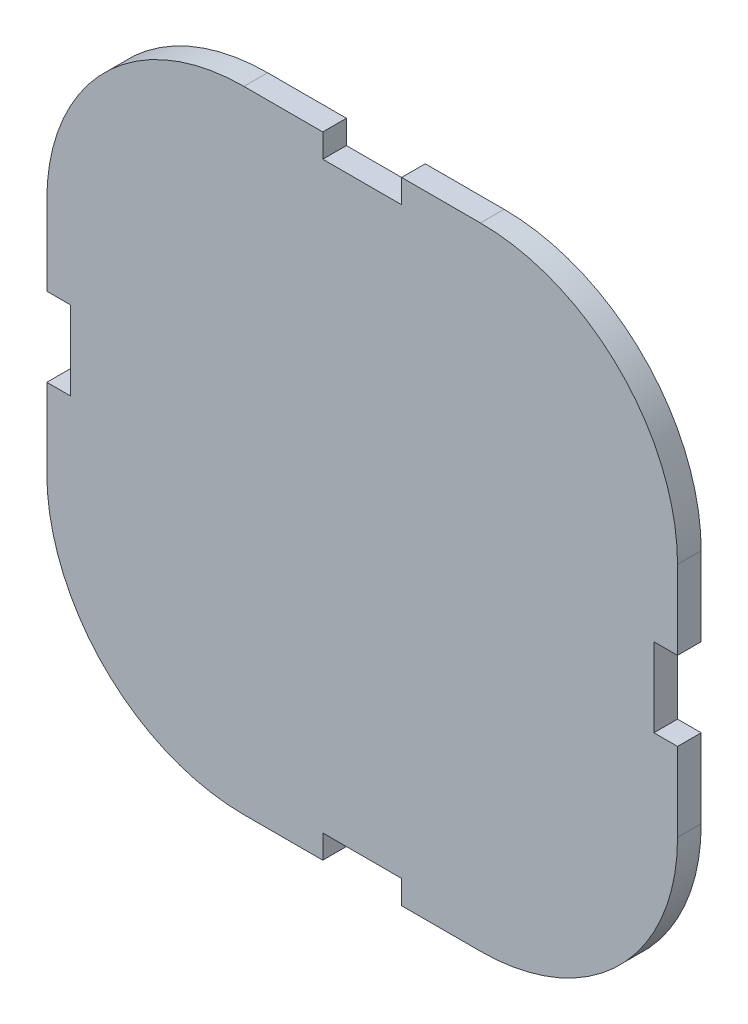
ISO-10303-21;
HEADER;
FILE_DESCRIPTION(('STEP AP214'),'2;1');
FILE_NAME('part.step','',(''),(''),'','','');
FILE_SCHEMA(('AUTOMOTIVE_DESIGN { 1 0 10303 214 1 1 1 1 }'));
ENDSEC;
DATA;
#1=APPLICATION_CONTEXT('core data for automotive mechanical design processes');
#2=APPLICATION_PROTOCOL_DEFINITION('international standard','automotive_design',2000,#1);
#3=PRODUCT_CONTEXT('',#1,'mechanical');
#4=PRODUCT('Part','Part','',(#3));
#5=PRODUCT_RELATED_PRODUCT_CATEGORY('part','',(#4));
#6=PRODUCT_DEFINITION_FORMATION('','',#4);
#7=PRODUCT_DEFINITION_CONTEXT('part definition',#1,'design');
#8=PRODUCT_DEFINITION('design','',#6,#7);
#9=PRODUCT_DEFINITION_SHAPE('','',#8);
#10=(LENGTH_UNIT() NAMED_UNIT(*) SI_UNIT(.MILLI.,.METRE.));
#11=(NAMED_UNIT(*) PLANE_ANGLE_UNIT() SI_UNIT($,.RADIAN.));
#12=(NAMED_UNIT(*) SI_UNIT($,.STERADIAN.) SOLID_ANGLE_UNIT());
#13=UNCERTAINTY_MEASURE_WITH_UNIT(LENGTH_MEASURE(1.E-05),#10,'distance_accuracy_value','');
#14=(GEOMETRIC_REPRESENTATION_CONTEXT(3) GLOBAL_UNCERTAINTY_ASSIGNED_CONTEXT((#13)) GLOBAL_UNIT_ASSIGNED_CONTEXT((#10,
#11,#12)) REPRESENTATION_CONTEXT('',''));
#15=CARTESIAN_POINT('',(0.,0.,0.));
#16=DIRECTION('',(0.,0.,1.));
#17=DIRECTION('',(1.,0.,0.));
#18=AXIS2_PLACEMENT_3D('',#15,#16,#17);
#19=CARTESIAN_POINT('',(0.,40.,3.));
#20=DIRECTION('',(0.,1.,0.));
#21=DIRECTION('',(-1.,0.,0.));
#22=AXIS2_PLACEMENT_3D('',#19,#20,#21);
#23=PLANE('',#22);
#24=DIRECTION('',(1.,0.,0.));
#25=VECTOR('',#24,1.);
#26=CARTESIAN_POINT('',(0.,40.,0.));
#27=LINE('',#26,#25);
#28=CARTESIAN_POINT('',(-15.,40.,0.));
#29=VERTEX_POINT('',#28);
#30=CARTESIAN_POINT('',(-5.,40.,0.));
#31=VERTEX_POINT('',#30);
#32=EDGE_CURVE('E225',#29,#31,#27,.T.);
#33=ORIENTED_EDGE('',*,*,#32,.F.);
#34=DIRECTION('',(0.,0.,-1.));
#35=VECTOR('',#34,1.);
#36=CARTESIAN_POINT('',(-15.,40.,3.));
#37=LINE('',#36,#35);
#38=CARTESIAN_POINT('',(-15.,40.,3.));
#39=VERTEX_POINT('',#38);
#40=EDGE_CURVE('E11',#39,#29,#37,.T.);
#41=ORIENTED_EDGE('',*,*,#40,.F.);
#42=DIRECTION('',(1.,0.,0.));
#43=VECTOR('',#42,1.);
#44=CARTESIAN_POINT('',(0.,40.,3.));
#45=LINE('',#44,#43);
#46=CARTESIAN_POINT('',(-5.,40.,3.));
#47=VERTEX_POINT('',#46);
#48=EDGE_CURVE('E279',#39,#47,#45,.T.);
#49=ORIENTED_EDGE('',*,*,#48,.T.);
#50=DIRECTION('',(0.,0.,-1.));
#51=VECTOR('',#50,1.);
#52=CARTESIAN_POINT('',(-5.,40.,3.));
#53=LINE('',#52,#51);
#54=EDGE_CURVE('E51',#47,#31,#53,.T.);
#55=ORIENTED_EDGE('',*,*,#54,.T.);
#56=EDGE_LOOP('',(#33,#41,#49,#55));
#57=FACE_BOUND('',#56,.T.);
#58=ADVANCED_FACE('F34',(#57),#23,.T.);
#59=CARTESIAN_POINT('',(-15.,15.,3.));
#60=DIRECTION('',(0.,0.,-1.));
#61=DIRECTION('',(-1.,0.,0.));
#62=AXIS2_PLACEMENT_3D('',#59,#60,#61);
#63=CYLINDRICAL_SURFACE('',#62,25.);
#64=CARTESIAN_POINT('',(-15.,15.,0.));
#65=DIRECTION('',(0.,0.,1.));
#66=DIRECTION('',(1.,0.,0.));
#67=AXIS2_PLACEMENT_3D('',#64,#65,#66);
#68=CIRCLE('',#67,25.);
#69=CARTESIAN_POINT('',(-40.,15.,0.));
#70=VERTEX_POINT('',#69);
#71=EDGE_CURVE('E227',#29,#70,#68,.T.);
#72=ORIENTED_EDGE('',*,*,#71,.T.);
#73=DIRECTION('',(0.,0.,-1.));
#74=VECTOR('',#73,1.);
#75=CARTESIAN_POINT('',(-40.,15.,3.));
#76=LINE('',#75,#74);
#77=CARTESIAN_POINT('',(-40.,15.,3.));
#78=VERTEX_POINT('',#77);
#79=EDGE_CURVE('E43',#78,#70,#76,.T.);
#80=ORIENTED_EDGE('',*,*,#79,.F.);
#81=CARTESIAN_POINT('',(-15.,15.,3.));
#82=DIRECTION('',(0.,0.,1.));
#83=DIRECTION('',(1.,0.,0.));
#84=AXIS2_PLACEMENT_3D('',#81,#82,#83);
#85=CIRCLE('',#84,25.);
#86=EDGE_CURVE('E350',#39,#78,#85,.T.);
#87=ORIENTED_EDGE('',*,*,#86,.F.);
#88=ORIENTED_EDGE('',*,*,#40,.T.);
#89=EDGE_LOOP('',(#72,#80,#87,#88));
#90=FACE_BOUND('',#89,.T.);
#91=ADVANCED_FACE('F36',(#90),#63,.T.);
#92=CARTESIAN_POINT('',(-40.,0.,3.));
#93=DIRECTION('',(1.,0.,0.));
#94=DIRECTION('',(0.,1.,0.));
#95=AXIS2_PLACEMENT_3D('',#92,#93,#94);
#96=PLANE('',#95);
#97=DIRECTION('',(0.,-1.,0.));
#98=VECTOR('',#97,1.);
#99=CARTESIAN_POINT('',(-40.,0.,0.));
#100=LINE('',#99,#98);
#101=CARTESIAN_POINT('',(-40.,4.99999999999999,0.));
#102=VERTEX_POINT('',#101);
#103=EDGE_CURVE('E230',#70,#102,#100,.T.);
#104=ORIENTED_EDGE('',*,*,#103,.T.);
#105=DIRECTION('',(0.,0.,-1.));
#106=VECTOR('',#105,1.);
#107=CARTESIAN_POINT('',(-40.,4.99999999999999,3.));
#108=LINE('',#107,#106);
#109=CARTESIAN_POINT('',(-40.,4.99999999999999,3.));
#110=VERTEX_POINT('',#109);
#111=EDGE_CURVE('E323',#110,#102,#108,.T.);
#112=ORIENTED_EDGE('',*,*,#111,.F.);
#113=DIRECTION('',(0.,-1.,0.));
#114=VECTOR('',#113,1.);
#115=CARTESIAN_POINT('',(-40.,0.,3.));
#116=LINE('',#115,#114);
#117=EDGE_CURVE('E332',#78,#110,#116,.T.);
#118=ORIENTED_EDGE('',*,*,#117,.F.);
#119=ORIENTED_EDGE('',*,*,#79,.T.);
#120=EDGE_LOOP('',(#104,#112,#118,#119));
#121=FACE_BOUND('',#120,.T.);
#122=ADVANCED_FACE('F330',(#121),#96,.F.);
#123=CARTESIAN_POINT('',(0.,4.99999999999999,3.));
#124=DIRECTION('',(0.,1.,0.));
#125=DIRECTION('',(0.,0.,1.));
#126=AXIS2_PLACEMENT_3D('',#123,#124,#125);
#127=PLANE('',#126);
#128=DIRECTION('',(1.,0.,0.));
#129=VECTOR('',#128,1.);
#130=CARTESIAN_POINT('',(0.,4.99999999999999,0.));
#131=LINE('',#130,#129);
#132=CARTESIAN_POINT('',(-37.,4.99999999999999,0.));
#133=VERTEX_POINT('',#132);
#134=EDGE_CURVE('E232',#102,#133,#131,.T.);
#135=ORIENTED_EDGE('',*,*,#134,.T.);
#136=DIRECTION('',(0.,0.,-1.));
#137=VECTOR('',#136,1.);
#138=CARTESIAN_POINT('',(-37.,4.99999999999999,3.));
#139=LINE('',#138,#137);
#140=CARTESIAN_POINT('',(-37.,4.99999999999999,3.));
#141=VERTEX_POINT('',#140);
#142=EDGE_CURVE('E321',#141,#133,#139,.T.);
#143=ORIENTED_EDGE('',*,*,#142,.F.);
#144=DIRECTION('',(1.,0.,0.));
#145=VECTOR('',#144,1.);
#146=CARTESIAN_POINT('',(0.,4.99999999999999,3.));
#147=LINE('',#146,#145);
#148=EDGE_CURVE('E344',#110,#141,#147,.T.);
#149=ORIENTED_EDGE('',*,*,#148,.F.);
#150=ORIENTED_EDGE('',*,*,#111,.T.);
#151=EDGE_LOOP('',(#135,#143,#149,#150));
#152=FACE_BOUND('',#151,.T.);
#153=ADVANCED_FACE('F341',(#152),#127,.F.);
#154=CARTESIAN_POINT('',(-37.,0.,3.));
#155=DIRECTION('',(-1.,0.,0.));
#156=DIRECTION('',(0.,0.,1.));
#157=AXIS2_PLACEMENT_3D('',#154,#155,#156);
#158=PLANE('',#157);
#159=DIRECTION('',(0.,1.,0.));
#160=VECTOR('',#159,1.);
#161=CARTESIAN_POINT('',(-37.,0.,0.));
#162=LINE('',#161,#160);
#163=CARTESIAN_POINT('',(-37.,-5.00000000000001,0.));
#164=VERTEX_POINT('',#163);
#165=EDGE_CURVE('E236',#164,#133,#162,.T.);
#166=ORIENTED_EDGE('',*,*,#165,.F.);
#167=DIRECTION('',(0.,0.,-1.));
#168=VECTOR('',#167,1.);
#169=CARTESIAN_POINT('',(-37.,-5.00000000000001,3.));
#170=LINE('',#169,#168);
#171=CARTESIAN_POINT('',(-37.,-5.00000000000001,3.));
#172=VERTEX_POINT('',#171);
#173=EDGE_CURVE('E319',#172,#164,#170,.T.);
#174=ORIENTED_EDGE('',*,*,#173,.F.);
#175=DIRECTION('',(0.,1.,0.));
#176=VECTOR('',#175,1.);
#177=CARTESIAN_POINT('',(-37.,0.,3.));
#178=LINE('',#177,#176);
#179=EDGE_CURVE('E346',#172,#141,#178,.T.);
#180=ORIENTED_EDGE('',*,*,#179,.T.);
#181=ORIENTED_EDGE('',*,*,#142,.T.);
#182=EDGE_LOOP('',(#166,#174,#180,#181));
#183=FACE_BOUND('',#182,.T.);
#184=ADVANCED_FACE('F474',(#183),#158,.T.);
#185=CARTESIAN_POINT('',(0.,-4.99999999999999,3.));
#186=DIRECTION('',(0.,1.,0.));
#187=DIRECTION('',(-1.,0.,0.));
#188=AXIS2_PLACEMENT_3D('',#185,#186,#187);
#189=PLANE('',#188);
#190=DIRECTION('',(1.,0.,0.));
#191=VECTOR('',#190,1.);
#192=CARTESIAN_POINT('',(0.,-4.99999999999999,0.));
#193=LINE('',#192,#191);
#194=CARTESIAN_POINT('',(-40.,-5.00000000000001,0.));
#195=VERTEX_POINT('',#194);
#196=EDGE_CURVE('E239',#195,#164,#193,.T.);
#197=ORIENTED_EDGE('',*,*,#196,.F.);
#198=DIRECTION('',(0.,0.,-1.));
#199=VECTOR('',#198,1.);
#200=CARTESIAN_POINT('',(-40.,-5.00000000000001,3.));
#201=LINE('',#200,#199);
#202=CARTESIAN_POINT('',(-40.,-5.00000000000001,3.));
#203=VERTEX_POINT('',#202);
#204=EDGE_CURVE('E317',#203,#195,#201,.T.);
#205=ORIENTED_EDGE('',*,*,#204,.F.);
#206=DIRECTION('',(1.,0.,0.));
#207=VECTOR('',#206,1.);
#208=CARTESIAN_POINT('',(0.,-4.99999999999999,3.));
#209=LINE('',#208,#207);
#210=EDGE_CURVE('E348',#203,#172,#209,.T.);
#211=ORIENTED_EDGE('',*,*,#210,.T.);
#212=ORIENTED_EDGE('',*,*,#173,.T.);
#213=EDGE_LOOP('',(#197,#205,#211,#212));
#214=FACE_BOUND('',#213,.T.);
#215=ADVANCED_FACE('F470',(#214),#189,.T.);
#216=CARTESIAN_POINT('',(-40.,-15.,0.));
#217=VERTEX_POINT('',#216);
#218=EDGE_CURVE('E233',#195,#217,#100,.T.);
#219=ORIENTED_EDGE('',*,*,#218,.T.);
#220=DIRECTION('',(0.,0.,-1.));
#221=VECTOR('',#220,1.);
#222=CARTESIAN_POINT('',(-40.,-15.,3.));
#223=LINE('',#222,#221);
#224=CARTESIAN_POINT('',(-40.,-15.,3.));
#225=VERTEX_POINT('',#224);
#226=EDGE_CURVE('E314',#225,#217,#223,.T.);
#227=ORIENTED_EDGE('',*,*,#226,.F.);
#228=EDGE_CURVE('E352',#203,#225,#116,.T.);
#229=ORIENTED_EDGE('',*,*,#228,.F.);
#230=ORIENTED_EDGE('',*,*,#204,.T.);
#231=EDGE_LOOP('',(#219,#227,#229,#230));
#232=FACE_BOUND('',#231,.T.);
#233=ADVANCED_FACE('F466',(#232),#96,.F.);
#234=CARTESIAN_POINT('',(-15.,-15.,3.));
#235=DIRECTION('',(0.,0.,-1.));
#236=DIRECTION('',(-1.,0.,0.));
#237=AXIS2_PLACEMENT_3D('',#234,#235,#236);
#238=CYLINDRICAL_SURFACE('',#237,25.);
#239=CARTESIAN_POINT('',(-15.,-15.,0.));
#240=DIRECTION('',(0.,0.,1.));
#241=DIRECTION('',(1.,0.,0.));
#242=AXIS2_PLACEMENT_3D('',#239,#240,#241);
#243=CIRCLE('',#242,25.);
#244=CARTESIAN_POINT('',(-15.,-40.,0.));
#245=VERTEX_POINT('',#244);
#246=EDGE_CURVE('E242',#217,#245,#243,.T.);
#247=ORIENTED_EDGE('',*,*,#246,.T.);
#248=DIRECTION('',(0.,0.,-1.));
#249=VECTOR('',#248,1.);
#250=CARTESIAN_POINT('',(-15.,-40.,3.));
#251=LINE('',#250,#249);
#252=CARTESIAN_POINT('',(-15.,-40.,3.));
#253=VERTEX_POINT('',#252);
#254=EDGE_CURVE('E311',#253,#245,#251,.T.);
#255=ORIENTED_EDGE('',*,*,#254,.F.);
#256=CARTESIAN_POINT('',(-15.,-15.,3.));
#257=DIRECTION('',(0.,0.,1.));
#258=DIRECTION('',(1.,0.,0.));
#259=AXIS2_PLACEMENT_3D('',#256,#257,#258);
#260=CIRCLE('',#259,25.);
#261=EDGE_CURVE('E357',#225,#253,#260,.T.);
#262=ORIENTED_EDGE('',*,*,#261,.F.);
#263=ORIENTED_EDGE('',*,*,#226,.T.);
#264=EDGE_LOOP('',(#247,#255,#262,#263));
#265=FACE_BOUND('',#264,.T.);
#266=ADVANCED_FACE('F463',(#265),#238,.T.);
#267=CARTESIAN_POINT('',(0.,-40.,3.));
#268=DIRECTION('',(0.,1.,0.));
#269=DIRECTION('',(-1.,0.,0.));
#270=AXIS2_PLACEMENT_3D('',#267,#268,#269);
#271=PLANE('',#270);
#272=DIRECTION('',(1.,0.,0.));
#273=VECTOR('',#272,1.);
#274=CARTESIAN_POINT('',(0.,-40.,0.));
#275=LINE('',#274,#273);
#276=CARTESIAN_POINT('',(-4.99999999999998,-40.,0.));
#277=VERTEX_POINT('',#276);
#278=EDGE_CURVE('E244',#245,#277,#275,.T.);
#279=ORIENTED_EDGE('',*,*,#278,.T.);
#280=DIRECTION('',(0.,0.,-1.));
#281=VECTOR('',#280,1.);
#282=CARTESIAN_POINT('',(-4.99999999999998,-40.,3.));
#283=LINE('',#282,#281);
#284=CARTESIAN_POINT('',(-4.99999999999998,-40.,3.));
#285=VERTEX_POINT('',#284);
#286=EDGE_CURVE('E308',#285,#277,#283,.T.);
#287=ORIENTED_EDGE('',*,*,#286,.F.);
#288=DIRECTION('',(1.,0.,0.));
#289=VECTOR('',#288,1.);
#290=CARTESIAN_POINT('',(0.,-40.,3.));
#291=LINE('',#290,#289);
#292=EDGE_CURVE('E359',#253,#285,#291,.T.);
#293=ORIENTED_EDGE('',*,*,#292,.F.);
#294=ORIENTED_EDGE('',*,*,#254,.T.);
#295=EDGE_LOOP('',(#279,#287,#293,#294));
#296=FACE_BOUND('',#295,.T.);
#297=ADVANCED_FACE('F451',(#296),#271,.F.);
#298=CARTESIAN_POINT('',(-5.00000000000016,0.,3.));
#299=DIRECTION('',(-1.,0.,0.));
#300=DIRECTION('',(0.,-1.,0.));
#301=AXIS2_PLACEMENT_3D('',#298,#299,#300);
#302=PLANE('',#301);
#303=DIRECTION('',(0.,1.,0.));
#304=VECTOR('',#303,1.);
#305=CARTESIAN_POINT('',(-5.00000000000016,0.,0.));
#306=LINE('',#305,#304);
#307=CARTESIAN_POINT('',(-4.99999999999999,-37.,0.));
#308=VERTEX_POINT('',#307);
#309=EDGE_CURVE('E246',#277,#308,#306,.T.);
#310=ORIENTED_EDGE('',*,*,#309,.T.);
#311=DIRECTION('',(0.,0.,-1.));
#312=VECTOR('',#311,1.);
#313=CARTESIAN_POINT('',(-4.99999999999999,-37.,3.));
#314=LINE('',#313,#312);
#315=CARTESIAN_POINT('',(-4.99999999999999,-37.,3.));
#316=VERTEX_POINT('',#315);
#317=EDGE_CURVE('E305',#316,#308,#314,.T.);
#318=ORIENTED_EDGE('',*,*,#317,.F.);
#319=DIRECTION('',(0.,1.,0.));
#320=VECTOR('',#319,1.);
#321=CARTESIAN_POINT('',(-5.00000000000016,0.,3.));
#322=LINE('',#321,#320);
#323=EDGE_CURVE('E361',#285,#316,#322,.T.);
#324=ORIENTED_EDGE('',*,*,#323,.F.);
#325=ORIENTED_EDGE('',*,*,#286,.T.);
#326=EDGE_LOOP('',(#310,#318,#324,#325));
#327=FACE_BOUND('',#326,.T.);
#328=ADVANCED_FACE('F458',(#327),#302,.F.);
#329=CARTESIAN_POINT('',(0.,-37.,3.));
#330=DIRECTION('',(0.,1.,0.));
#331=DIRECTION('',(-1.,0.,0.));
#332=AXIS2_PLACEMENT_3D('',#329,#330,#331);
#333=PLANE('',#332);
#334=DIRECTION('',(1.,0.,0.));
#335=VECTOR('',#334,1.);
#336=CARTESIAN_POINT('',(0.,-37.,0.));
#337=LINE('',#336,#335);
#338=CARTESIAN_POINT('',(5.00000000000001,-37.,0.));
#339=VERTEX_POINT('',#338);
#340=EDGE_CURVE('E249',#308,#339,#337,.T.);
#341=ORIENTED_EDGE('',*,*,#340,.T.);
#342=DIRECTION('',(0.,0.,-1.));
#343=VECTOR('',#342,1.);
#344=CARTESIAN_POINT('',(5.00000000000001,-37.,3.));
#345=LINE('',#344,#343);
#346=CARTESIAN_POINT('',(5.00000000000001,-37.,3.));
#347=VERTEX_POINT('',#346);
#348=EDGE_CURVE('E303',#347,#339,#345,.T.);
#349=ORIENTED_EDGE('',*,*,#348,.F.);
#350=DIRECTION('',(1.,0.,0.));
#351=VECTOR('',#350,1.);
#352=CARTESIAN_POINT('',(0.,-37.,3.));
#353=LINE('',#352,#351);
#354=EDGE_CURVE('E364',#316,#347,#353,.T.);
#355=ORIENTED_EDGE('',*,*,#354,.F.);
#356=ORIENTED_EDGE('',*,*,#317,.T.);
#357=EDGE_LOOP('',(#341,#349,#355,#356));
#358=FACE_BOUND('',#357,.T.);
#359=ADVANCED_FACE('F454',(#358),#333,.F.);
#360=CARTESIAN_POINT('',(4.99999999999984,0.,3.));
#361=DIRECTION('',(-1.,0.,0.));
#362=DIRECTION('',(0.,-1.,0.));
#363=AXIS2_PLACEMENT_3D('',#360,#361,#362);
#364=PLANE('',#363);
#365=DIRECTION('',(0.,1.,0.));
#366=VECTOR('',#365,1.);
#367=CARTESIAN_POINT('',(4.99999999999984,0.,0.));
#368=LINE('',#367,#366);
#369=CARTESIAN_POINT('',(5.00000000000001,-40.,0.));
#370=VERTEX_POINT('',#369);
#371=EDGE_CURVE('E252',#370,#339,#368,.T.);
#372=ORIENTED_EDGE('',*,*,#371,.F.);
#373=DIRECTION('',(0.,0.,-1.));
#374=VECTOR('',#373,1.);
#375=CARTESIAN_POINT('',(5.00000000000001,-40.,3.));
#376=LINE('',#375,#374);
#377=CARTESIAN_POINT('',(5.00000000000001,-40.,3.));
#378=VERTEX_POINT('',#377);
#379=EDGE_CURVE('E301',#378,#370,#376,.T.);
#380=ORIENTED_EDGE('',*,*,#379,.F.);
#381=DIRECTION('',(0.,1.,0.));
#382=VECTOR('',#381,1.);
#383=CARTESIAN_POINT('',(4.99999999999984,0.,3.));
#384=LINE('',#383,#382);
#385=EDGE_CURVE('E366',#378,#347,#384,.T.);
#386=ORIENTED_EDGE('',*,*,#385,.T.);
#387=ORIENTED_EDGE('',*,*,#348,.T.);
#388=EDGE_LOOP('',(#372,#380,#386,#387));
#389=FACE_BOUND('',#388,.T.);
#390=ADVANCED_FACE('F449',(#389),#364,.T.);
#391=CARTESIAN_POINT('',(15.,-40.,0.));
#392=VERTEX_POINT('',#391);
#393=EDGE_CURVE('E247',#370,#392,#275,.T.);
#394=ORIENTED_EDGE('',*,*,#393,.T.);
#395=DIRECTION('',(0.,0.,-1.));
#396=VECTOR('',#395,1.);
#397=CARTESIAN_POINT('',(15.,-40.,3.));
#398=LINE('',#397,#396);
#399=CARTESIAN_POINT('',(15.,-40.,3.));
#400=VERTEX_POINT('',#399);
#401=EDGE_CURVE('E298',#400,#392,#398,.T.);
#402=ORIENTED_EDGE('',*,*,#401,.F.);
#403=EDGE_CURVE('E362',#378,#400,#291,.T.);
#404=ORIENTED_EDGE('',*,*,#403,.F.);
#405=ORIENTED_EDGE('',*,*,#379,.T.);
#406=EDGE_LOOP('',(#394,#402,#404,#405));
#407=FACE_BOUND('',#406,.T.);
#408=ADVANCED_FACE('F445',(#407),#271,.F.);
#409=CARTESIAN_POINT('',(15.,-15.,3.));
#410=DIRECTION('',(0.,0.,-1.));
#411=DIRECTION('',(-1.,0.,0.));
#412=AXIS2_PLACEMENT_3D('',#409,#410,#411);
#413=CYLINDRICAL_SURFACE('',#412,25.);
#414=CARTESIAN_POINT('',(15.,-15.,0.));
#415=DIRECTION('',(0.,0.,1.));
#416=DIRECTION('',(1.,0.,0.));
#417=AXIS2_PLACEMENT_3D('',#414,#415,#416);
#418=CIRCLE('',#417,25.);
#419=CARTESIAN_POINT('',(40.,-15.,0.));
#420=VERTEX_POINT('',#419);
#421=EDGE_CURVE('E255',#392,#420,#418,.T.);
#422=ORIENTED_EDGE('',*,*,#421,.T.);
#423=DIRECTION('',(0.,0.,-1.));
#424=VECTOR('',#423,1.);
#425=CARTESIAN_POINT('',(40.,-15.,3.));
#426=LINE('',#425,#424);
#427=CARTESIAN_POINT('',(40.,-15.,3.));
#428=VERTEX_POINT('',#427);
#429=EDGE_CURVE('E296',#428,#420,#426,.T.);
#430=ORIENTED_EDGE('',*,*,#429,.F.);
#431=CARTESIAN_POINT('',(15.,-15.,3.));
#432=DIRECTION('',(0.,0.,1.));
#433=DIRECTION('',(1.,0.,0.));
#434=AXIS2_PLACEMENT_3D('',#431,#432,#433);
#435=CIRCLE('',#434,25.);
#436=EDGE_CURVE('E369',#400,#428,#435,.T.);
#437=ORIENTED_EDGE('',*,*,#436,.F.);
#438=ORIENTED_EDGE('',*,*,#401,.T.);
#439=EDGE_LOOP('',(#422,#430,#437,#438));
#440=FACE_BOUND('',#439,.T.);
#441=ADVANCED_FACE('F442',(#440),#413,.T.);
#442=CARTESIAN_POINT('',(40.,0.,3.));
#443=DIRECTION('',(1.,0.,0.));
#444=DIRECTION('',(0.,0.,-1.));
#445=AXIS2_PLACEMENT_3D('',#442,#443,#444);
#446=PLANE('',#445);
#447=DIRECTION('',(0.,-1.,0.));
#448=VECTOR('',#447,1.);
#449=CARTESIAN_POINT('',(40.,0.,0.));
#450=LINE('',#449,#448);
#451=CARTESIAN_POINT('',(40.,-5.00000000000001,0.));
#452=VERTEX_POINT('',#451);
#453=EDGE_CURVE('E258',#452,#420,#450,.T.);
#454=ORIENTED_EDGE('',*,*,#453,.F.);
#455=DIRECTION('',(0.,0.,-1.));
#456=VECTOR('',#455,1.);
#457=CARTESIAN_POINT('',(40.,-5.00000000000001,3.));
#458=LINE('',#457,#456);
#459=CARTESIAN_POINT('',(40.,-5.00000000000001,3.));
#460=VERTEX_POINT('',#459);
#461=EDGE_CURVE('E294',#460,#452,#458,.T.);
#462=ORIENTED_EDGE('',*,*,#461,.F.);
#463=DIRECTION('',(0.,-1.,0.));
#464=VECTOR('',#463,1.);
#465=CARTESIAN_POINT('',(40.,0.,3.));
#466=LINE('',#465,#464);
#467=EDGE_CURVE('E371',#460,#428,#466,.T.);
#468=ORIENTED_EDGE('',*,*,#467,.T.);
#469=ORIENTED_EDGE('',*,*,#429,.T.);
#470=EDGE_LOOP('',(#454,#462,#468,#469));
#471=FACE_BOUND('',#470,.T.);
#472=ADVANCED_FACE('F430',(#471),#446,.T.);
#473=CARTESIAN_POINT('',(0.,-4.99999999999999,3.));
#474=DIRECTION('',(0.,-1.,0.));
#475=DIRECTION('',(1.,0.,0.));
#476=AXIS2_PLACEMENT_3D('',#473,#474,#475);
#477=PLANE('',#476);
#478=DIRECTION('',(-1.,0.,0.));
#479=VECTOR('',#478,1.);
#480=CARTESIAN_POINT('',(0.,-4.99999999999999,0.));
#481=LINE('',#480,#479);
#482=CARTESIAN_POINT('',(37.,-5.00000000000001,0.));
#483=VERTEX_POINT('',#482);
#484=EDGE_CURVE('E261',#452,#483,#481,.T.);
#485=ORIENTED_EDGE('',*,*,#484,.T.);
#486=DIRECTION('',(0.,0.,-1.));
#487=VECTOR('',#486,1.);
#488=CARTESIAN_POINT('',(37.,-5.00000000000001,3.));
#489=LINE('',#488,#487);
#490=CARTESIAN_POINT('',(37.,-5.00000000000001,3.));
#491=VERTEX_POINT('',#490);
#492=EDGE_CURVE('E291',#491,#483,#489,.T.);
#493=ORIENTED_EDGE('',*,*,#492,.F.);
#494=DIRECTION('',(-1.,0.,0.));
#495=VECTOR('',#494,1.);
#496=CARTESIAN_POINT('',(0.,-4.99999999999999,3.));
#497=LINE('',#496,#495);
#498=EDGE_CURVE('E374',#460,#491,#497,.T.);
#499=ORIENTED_EDGE('',*,*,#498,.F.);
#500=ORIENTED_EDGE('',*,*,#461,.T.);
#501=EDGE_LOOP('',(#485,#493,#499,#500));
#502=FACE_BOUND('',#501,.T.);
#503=ADVANCED_FACE('F437',(#502),#477,.F.);
#504=CARTESIAN_POINT('',(37.,0.,3.));
#505=DIRECTION('',(-1.,0.,0.));
#506=DIRECTION('',(0.,0.,1.));
#507=AXIS2_PLACEMENT_3D('',#504,#505,#506);
#508=PLANE('',#507);
#509=DIRECTION('',(0.,1.,0.));
#510=VECTOR('',#509,1.);
#511=CARTESIAN_POINT('',(37.,0.,0.));
#512=LINE('',#511,#510);
#513=CARTESIAN_POINT('',(37.,4.99999999999999,0.));
#514=VERTEX_POINT('',#513);
#515=EDGE_CURVE('E264',#483,#514,#512,.T.);
#516=ORIENTED_EDGE('',*,*,#515,.T.);
#517=DIRECTION('',(0.,0.,-1.));
#518=VECTOR('',#517,1.);
#519=CARTESIAN_POINT('',(37.,4.99999999999999,3.));
#520=LINE('',#519,#518);
#521=CARTESIAN_POINT('',(37.,4.99999999999999,3.));
#522=VERTEX_POINT('',#521);
#523=EDGE_CURVE('E289',#522,#514,#520,.T.);
#524=ORIENTED_EDGE('',*,*,#523,.F.);
#525=DIRECTION('',(0.,1.,0.));
#526=VECTOR('',#525,1.);
#527=CARTESIAN_POINT('',(37.,0.,3.));
#528=LINE('',#527,#526);
#529=EDGE_CURVE('E377',#491,#522,#528,.T.);
#530=ORIENTED_EDGE('',*,*,#529,.F.);
#531=ORIENTED_EDGE('',*,*,#492,.T.);
#532=EDGE_LOOP('',(#516,#524,#530,#531));
#533=FACE_BOUND('',#532,.T.);
#534=ADVANCED_FACE('F434',(#533),#508,.F.);
#535=CARTESIAN_POINT('',(0.,4.99999999999999,3.));
#536=DIRECTION('',(0.,-1.,0.));
#537=DIRECTION('',(0.,0.,-1.));
#538=AXIS2_PLACEMENT_3D('',#535,#536,#537);
#539=PLANE('',#538);
#540=DIRECTION('',(-1.,0.,0.));
#541=VECTOR('',#540,1.);
#542=CARTESIAN_POINT('',(0.,4.99999999999999,0.));
#543=LINE('',#542,#541);
#544=CARTESIAN_POINT('',(40.,4.99999999999999,0.));
#545=VERTEX_POINT('',#544);
#546=EDGE_CURVE('E267',#545,#514,#543,.T.);
#547=ORIENTED_EDGE('',*,*,#546,.F.);
#548=DIRECTION('',(0.,0.,-1.));
#549=VECTOR('',#548,1.);
#550=CARTESIAN_POINT('',(40.,4.99999999999999,3.));
#551=LINE('',#550,#549);
#552=CARTESIAN_POINT('',(40.,4.99999999999999,3.));
#553=VERTEX_POINT('',#552);
#554=EDGE_CURVE('E287',#553,#545,#551,.T.);
#555=ORIENTED_EDGE('',*,*,#554,.F.);
#556=DIRECTION('',(-1.,0.,0.));
#557=VECTOR('',#556,1.);
#558=CARTESIAN_POINT('',(0.,4.99999999999999,3.));
#559=LINE('',#558,#557);
#560=EDGE_CURVE('E379',#553,#522,#559,.T.);
#561=ORIENTED_EDGE('',*,*,#560,.T.);
#562=ORIENTED_EDGE('',*,*,#523,.T.);
#563=EDGE_LOOP('',(#547,#555,#561,#562));
#564=FACE_BOUND('',#563,.T.);
#565=ADVANCED_FACE('F395',(#564),#539,.T.);
#566=CARTESIAN_POINT('',(40.,15.,0.));
#567=VERTEX_POINT('',#566);
#568=EDGE_CURVE('E262',#567,#545,#450,.T.);
#569=ORIENTED_EDGE('',*,*,#568,.F.);
#570=DIRECTION('',(0.,0.,-1.));
#571=VECTOR('',#570,1.);
#572=CARTESIAN_POINT('',(40.,15.,3.));
#573=LINE('',#572,#571);
#574=CARTESIAN_POINT('',(40.,15.,3.));
#575=VERTEX_POINT('',#574);
#576=EDGE_CURVE('E285',#575,#567,#573,.T.);
#577=ORIENTED_EDGE('',*,*,#576,.F.);
#578=EDGE_CURVE('E375',#575,#553,#466,.T.);
#579=ORIENTED_EDGE('',*,*,#578,.T.);
#580=ORIENTED_EDGE('',*,*,#554,.T.);
#581=EDGE_LOOP('',(#569,#577,#579,#580));
#582=FACE_BOUND('',#581,.T.);
#583=ADVANCED_FACE('F389',(#582),#446,.T.);
#584=CARTESIAN_POINT('',(15.,15.,3.));
#585=DIRECTION('',(0.,0.,-1.));
#586=DIRECTION('',(-1.,0.,0.));
#587=AXIS2_PLACEMENT_3D('',#584,#585,#586);
#588=CYLINDRICAL_SURFACE('',#587,25.);
#589=CARTESIAN_POINT('',(15.,15.,0.));
#590=DIRECTION('',(0.,0.,1.));
#591=DIRECTION('',(1.,0.,0.));
#592=AXIS2_PLACEMENT_3D('',#589,#590,#591);
#593=CIRCLE('',#592,25.);
#594=CARTESIAN_POINT('',(15.,40.,0.));
#595=VERTEX_POINT('',#594);
#596=EDGE_CURVE('E270',#595,#567,#593,.F.);
#597=ORIENTED_EDGE('',*,*,#596,.F.);
#598=DIRECTION('',(0.,0.,-1.));
#599=VECTOR('',#598,1.);
#600=CARTESIAN_POINT('',(15.,40.,3.));
#601=LINE('',#600,#599);
#602=CARTESIAN_POINT('',(15.,40.,3.));
#603=VERTEX_POINT('',#602);
#604=EDGE_CURVE('E283',#603,#595,#601,.T.);
#605=ORIENTED_EDGE('',*,*,#604,.F.);
#606=CARTESIAN_POINT('',(15.,15.,3.));
#607=DIRECTION('',(0.,0.,1.));
#608=DIRECTION('',(1.,0.,0.));
#609=AXIS2_PLACEMENT_3D('',#606,#607,#608);
#610=CIRCLE('',#609,25.);
#611=EDGE_CURVE('E381',#603,#575,#610,.F.);
#612=ORIENTED_EDGE('',*,*,#611,.T.);
#613=ORIENTED_EDGE('',*,*,#576,.T.);
#614=EDGE_LOOP('',(#597,#605,#612,#613));
#615=FACE_BOUND('',#614,.T.);
#616=ADVANCED_FACE('F401',(#615),#588,.T.);
#617=CARTESIAN_POINT('',(5.,40.,0.));
#618=VERTEX_POINT('',#617);
#619=EDGE_CURVE('E228',#618,#595,#27,.T.);
#620=ORIENTED_EDGE('',*,*,#619,.F.);
#621=DIRECTION('',(0.,0.,-1.));
#622=VECTOR('',#621,1.);
#623=CARTESIAN_POINT('',(5.,40.,3.));
#624=LINE('',#623,#622);
#625=CARTESIAN_POINT('',(5.,40.,3.));
#626=VERTEX_POINT('',#625);
#627=EDGE_CURVE('E217',#626,#618,#624,.T.);
#628=ORIENTED_EDGE('',*,*,#627,.F.);
#629=EDGE_CURVE('E207',#626,#603,#45,.T.);
#630=ORIENTED_EDGE('',*,*,#629,.T.);
#631=ORIENTED_EDGE('',*,*,#604,.T.);
#632=EDGE_LOOP('',(#620,#628,#630,#631));
#633=FACE_BOUND('',#632,.T.);
#634=ADVANCED_FACE('F403',(#633),#23,.T.);
#635=CARTESIAN_POINT('',(5.00000000000002,0.,3.));
#636=DIRECTION('',(1.,0.,0.));
#637=DIRECTION('',(0.,1.,0.));
#638=AXIS2_PLACEMENT_3D('',#635,#636,#637);
#639=PLANE('',#638);
#640=DIRECTION('',(0.,-1.,0.));
#641=VECTOR('',#640,1.);
#642=CARTESIAN_POINT('',(5.00000000000002,0.,0.));
#643=LINE('',#642,#641);
#644=CARTESIAN_POINT('',(5.00000000000001,37.,0.));
#645=VERTEX_POINT('',#644);
#646=EDGE_CURVE('E214',#618,#645,#643,.T.);
#647=ORIENTED_EDGE('',*,*,#646,.T.);
#648=DIRECTION('',(0.,0.,-1.));
#649=VECTOR('',#648,1.);
#650=CARTESIAN_POINT('',(5.00000000000001,37.,3.));
#651=LINE('',#650,#649);
#652=CARTESIAN_POINT('',(5.00000000000001,37.,3.));
#653=VERTEX_POINT('',#652);
#654=EDGE_CURVE('E211',#653,#645,#651,.T.);
#655=ORIENTED_EDGE('',*,*,#654,.F.);
#656=DIRECTION('',(0.,-1.,0.));
#657=VECTOR('',#656,1.);
#658=CARTESIAN_POINT('',(5.00000000000002,0.,3.));
#659=LINE('',#658,#657);
#660=EDGE_CURVE('E198',#626,#653,#659,.T.);
#661=ORIENTED_EDGE('',*,*,#660,.F.);
#662=ORIENTED_EDGE('',*,*,#627,.T.);
#663=EDGE_LOOP('',(#647,#655,#661,#662));
#664=FACE_BOUND('',#663,.T.);
#665=ADVANCED_FACE('F212',(#664),#639,.F.);
#666=CARTESIAN_POINT('',(0.,37.,3.));
#667=DIRECTION('',(0.,1.,0.));
#668=DIRECTION('',(0.,0.,1.));
#669=AXIS2_PLACEMENT_3D('',#666,#667,#668);
#670=PLANE('',#669);
#671=DIRECTION('',(1.,0.,0.));
#672=VECTOR('',#671,1.);
#673=CARTESIAN_POINT('',(0.,37.,0.));
#674=LINE('',#673,#672);
#675=CARTESIAN_POINT('',(-4.99999999999999,37.,0.));
#676=VERTEX_POINT('',#675);
#677=EDGE_CURVE('E274',#676,#645,#674,.T.);
#678=ORIENTED_EDGE('',*,*,#677,.F.);
#679=DIRECTION('',(0.,0.,-1.));
#680=VECTOR('',#679,1.);
#681=CARTESIAN_POINT('',(-4.99999999999999,37.,3.));
#682=LINE('',#681,#680);
#683=CARTESIAN_POINT('',(-4.99999999999999,37.,3.));
#684=VERTEX_POINT('',#683);
#685=EDGE_CURVE('E124',#684,#676,#682,.T.);
#686=ORIENTED_EDGE('',*,*,#685,.F.);
#687=DIRECTION('',(1.,0.,0.));
#688=VECTOR('',#687,1.);
#689=CARTESIAN_POINT('',(0.,37.,3.));
#690=LINE('',#689,#688);
#691=EDGE_CURVE('E204',#684,#653,#690,.T.);
#692=ORIENTED_EDGE('',*,*,#691,.T.);
#693=ORIENTED_EDGE('',*,*,#654,.T.);
#694=EDGE_LOOP('',(#678,#686,#692,#693));
#695=FACE_BOUND('',#694,.T.);
#696=ADVANCED_FACE('F219',(#695),#670,.T.);
#697=CARTESIAN_POINT('',(-4.99999999999998,0.,3.));
#698=DIRECTION('',(1.,0.,0.));
#699=DIRECTION('',(0.,1.,0.));
#700=AXIS2_PLACEMENT_3D('',#697,#698,#699);
#701=PLANE('',#700);
#702=DIRECTION('',(0.,-1.,0.));
#703=VECTOR('',#702,1.);
#704=CARTESIAN_POINT('',(-4.99999999999998,0.,0.));
#705=LINE('',#704,#703);
#706=EDGE_CURVE('E276',#31,#676,#705,.T.);
#707=ORIENTED_EDGE('',*,*,#706,.F.);
#708=ORIENTED_EDGE('',*,*,#54,.F.);
#709=DIRECTION('',(0.,-1.,0.));
#710=VECTOR('',#709,1.);
#711=CARTESIAN_POINT('',(-4.99999999999998,0.,3.));
#712=LINE('',#711,#710);
#713=EDGE_CURVE('E220',#47,#684,#712,.T.);
#714=ORIENTED_EDGE('',*,*,#713,.T.);
#715=ORIENTED_EDGE('',*,*,#685,.T.);
#716=EDGE_LOOP('',(#707,#708,#714,#715));
#717=FACE_BOUND('',#716,.T.);
#718=ADVANCED_FACE('F404',(#717),#701,.T.);
#719=CARTESIAN_POINT('',(0.,0.,3.));
#720=DIRECTION('',(0.,0.,1.));
#721=DIRECTION('',(1.,0.,0.));
#722=AXIS2_PLACEMENT_3D('',#719,#720,#721);
#723=PLANE('',#722);
#724=ORIENTED_EDGE('',*,*,#48,.F.);
#725=ORIENTED_EDGE('',*,*,#86,.T.);
#726=ORIENTED_EDGE('',*,*,#117,.T.);
#727=ORIENTED_EDGE('',*,*,#148,.T.);
#728=ORIENTED_EDGE('',*,*,#179,.F.);
#729=ORIENTED_EDGE('',*,*,#210,.F.);
#730=ORIENTED_EDGE('',*,*,#228,.T.);
#731=ORIENTED_EDGE('',*,*,#261,.T.);
#732=ORIENTED_EDGE('',*,*,#292,.T.);
#733=ORIENTED_EDGE('',*,*,#323,.T.);
#734=ORIENTED_EDGE('',*,*,#354,.T.);
#735=ORIENTED_EDGE('',*,*,#385,.F.);
#736=ORIENTED_EDGE('',*,*,#403,.T.);
#737=ORIENTED_EDGE('',*,*,#436,.T.);
#738=ORIENTED_EDGE('',*,*,#467,.F.);
#739=ORIENTED_EDGE('',*,*,#498,.T.);
#740=ORIENTED_EDGE('',*,*,#529,.T.);
#741=ORIENTED_EDGE('',*,*,#560,.F.);
#742=ORIENTED_EDGE('',*,*,#578,.F.);
#743=ORIENTED_EDGE('',*,*,#611,.F.);
#744=ORIENTED_EDGE('',*,*,#629,.F.);
#745=ORIENTED_EDGE('',*,*,#660,.T.);
#746=ORIENTED_EDGE('',*,*,#691,.F.);
#747=ORIENTED_EDGE('',*,*,#713,.F.);
#748=EDGE_LOOP('',(#724,#725,#726,#727,#728,#729,#730,#731,#732,#733,#734,#735,#736,#737,#738,
#739,#740,#741,#742,#743,#744,#745,#746,#747));
#749=FACE_BOUND('',#748,.T.);
#750=ADVANCED_FACE('F201',(#749),#723,.T.);
#751=CARTESIAN_POINT('',(0.,0.,0.));
#752=DIRECTION('',(0.,0.,1.));
#753=DIRECTION('',(1.,0.,0.));
#754=AXIS2_PLACEMENT_3D('',#751,#752,#753);
#755=PLANE('',#754);
#756=ORIENTED_EDGE('',*,*,#32,.T.);
#757=ORIENTED_EDGE('',*,*,#706,.T.);
#758=ORIENTED_EDGE('',*,*,#677,.T.);
#759=ORIENTED_EDGE('',*,*,#646,.F.);
#760=ORIENTED_EDGE('',*,*,#619,.T.);
#761=ORIENTED_EDGE('',*,*,#596,.T.);
#762=ORIENTED_EDGE('',*,*,#568,.T.);
#763=ORIENTED_EDGE('',*,*,#546,.T.);
#764=ORIENTED_EDGE('',*,*,#515,.F.);
#765=ORIENTED_EDGE('',*,*,#484,.F.);
#766=ORIENTED_EDGE('',*,*,#453,.T.);
#767=ORIENTED_EDGE('',*,*,#421,.F.);
#768=ORIENTED_EDGE('',*,*,#393,.F.);
#769=ORIENTED_EDGE('',*,*,#371,.T.);
#770=ORIENTED_EDGE('',*,*,#340,.F.);
#771=ORIENTED_EDGE('',*,*,#309,.F.);
#772=ORIENTED_EDGE('',*,*,#278,.F.);
#773=ORIENTED_EDGE('',*,*,#246,.F.);
#774=ORIENTED_EDGE('',*,*,#218,.F.);
#775=ORIENTED_EDGE('',*,*,#196,.T.);
#776=ORIENTED_EDGE('',*,*,#165,.T.);
#777=ORIENTED_EDGE('',*,*,#134,.F.);
#778=ORIENTED_EDGE('',*,*,#103,.F.);
#779=ORIENTED_EDGE('',*,*,#71,.F.);
#780=EDGE_LOOP('',(#756,#757,#758,#759,#760,#761,#762,#763,#764,#765,#766,#767,#768,#769,#770,
#771,#772,#773,#774,#775,#776,#777,#778,#779));
#781=FACE_BOUND('',#780,.T.);
#782=ADVANCED_FACE('F337',(#781),#755,.F.);
#783=CLOSED_SHELL('',(#58,#91,#122,#153,#184,#215,#233,#266,#297,#328,#359,#390,#408,#441,#472,
#503,#534,#565,#583,#616,#634,#665,#696,#718,#750,#782));
#784=MANIFOLD_SOLID_BREP('B2',#783);
#785=ADVANCED_BREP_SHAPE_REPRESENTATION('',(#18,#784),#14);
#786=SHAPE_DEFINITION_REPRESENTATION(#9,#785);
ENDSEC;
END-ISO-10303-21;
